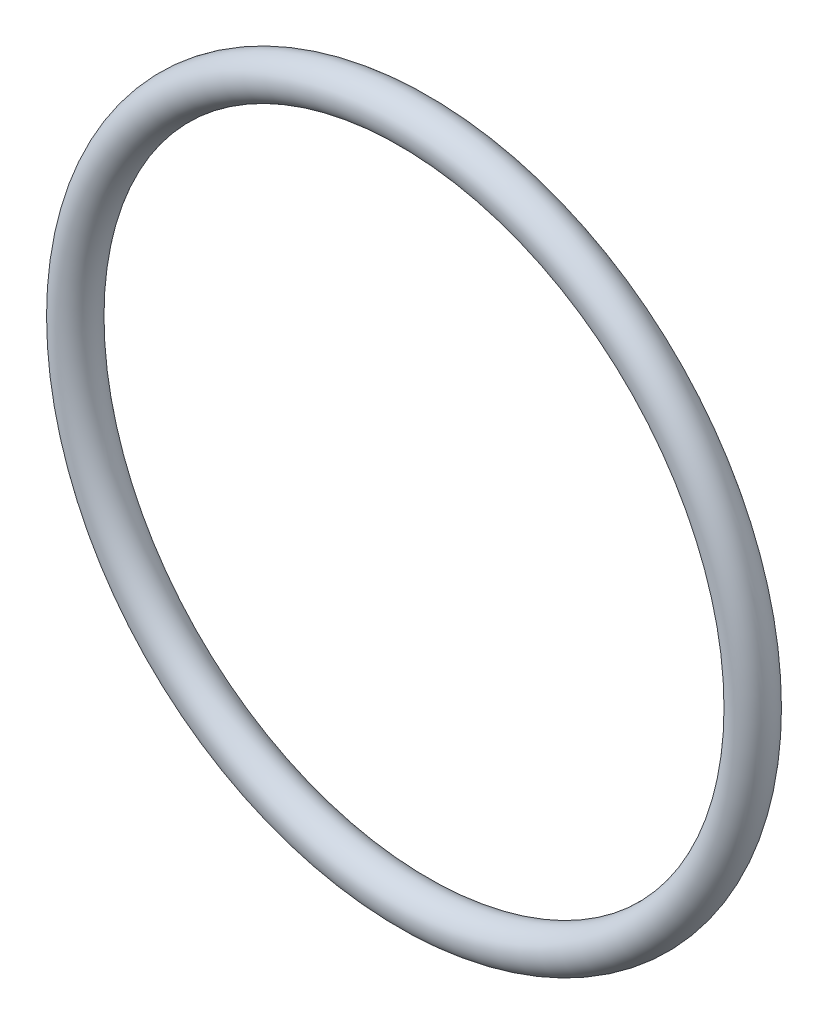
ISO-10303-21;
HEADER;
FILE_DESCRIPTION(('STEP AP214'),'2;1');
FILE_NAME('part.step','',(''),(''),'','','');
FILE_SCHEMA(('AUTOMOTIVE_DESIGN { 1 0 10303 214 1 1 1 1 }'));
ENDSEC;
DATA;
#1=APPLICATION_CONTEXT('core data for automotive mechanical design processes');
#2=APPLICATION_PROTOCOL_DEFINITION('international standard','automotive_design',2000,#1);
#3=PRODUCT_CONTEXT('',#1,'mechanical');
#4=PRODUCT('Part','Part','',(#3));
#5=PRODUCT_RELATED_PRODUCT_CATEGORY('part','',(#4));
#6=PRODUCT_DEFINITION_FORMATION('','',#4);
#7=PRODUCT_DEFINITION_CONTEXT('part definition',#1,'design');
#8=PRODUCT_DEFINITION('design','',#6,#7);
#9=PRODUCT_DEFINITION_SHAPE('','',#8);
#10=(LENGTH_UNIT() NAMED_UNIT(*) SI_UNIT(.MILLI.,.METRE.));
#11=(NAMED_UNIT(*) PLANE_ANGLE_UNIT() SI_UNIT($,.RADIAN.));
#12=(NAMED_UNIT(*) SI_UNIT($,.STERADIAN.) SOLID_ANGLE_UNIT());
#13=UNCERTAINTY_MEASURE_WITH_UNIT(LENGTH_MEASURE(1.E-05),#10,'distance_accuracy_value','');
#14=(GEOMETRIC_REPRESENTATION_CONTEXT(3) GLOBAL_UNCERTAINTY_ASSIGNED_CONTEXT((#13)) GLOBAL_UNIT_ASSIGNED_CONTEXT((#10,
#11,#12)) REPRESENTATION_CONTEXT('',''));
#15=CARTESIAN_POINT('',(0.,0.,0.));
#16=DIRECTION('',(0.,0.,1.));
#17=DIRECTION('',(1.,0.,0.));
#18=AXIS2_PLACEMENT_3D('',#15,#16,#17);
#19=CARTESIAN_POINT('',(0.,0.,0.));
#20=DIRECTION('',(0.,0.,1.));
#21=DIRECTION('',(1.,0.,0.));
#22=AXIS2_PLACEMENT_3D('',#19,#20,#21);
#23=TOROIDAL_SURFACE('',#22,25.4,1.524);
#24=CARTESIAN_POINT('',(25.4,0.,0.));
#25=DIRECTION('',(0.,1.,0.));
#26=DIRECTION('',(-1.,0.,0.));
#27=AXIS2_PLACEMENT_3D('',#24,#25,#26);
#28=CIRCLE('',#27,1.524);
#29=CARTESIAN_POINT('',(26.924,0.,0.));
#30=VERTEX_POINT('',#29);
#31=EDGE_CURVE('E11',#30,#30,#28,.T.);
#32=CARTESIAN_POINT('',(0.,0.,0.));
#33=DIRECTION('',(0.,0.,1.));
#34=DIRECTION('',(1.,0.,0.));
#35=AXIS2_PLACEMENT_3D('',#32,#33,#34);
#36=CIRCLE('',#35,26.924);
#37=EDGE_CURVE('',#30,#30,#36,.T.);
#38=ORIENTED_EDGE('',*,*,#31,.T.);
#39=ORIENTED_EDGE('',*,*,#31,.F.);
#40=ORIENTED_EDGE('',*,*,#37,.T.);
#41=ORIENTED_EDGE('',*,*,#37,.F.);
#42=EDGE_LOOP('',(#38,#40,#39,#41));
#43=FACE_BOUND('',#42,.T.);
#44=ADVANCED_FACE('F46',(#43),#23,.T.);
#45=CLOSED_SHELL('',(#44));
#46=MANIFOLD_SOLID_BREP('B2',#45);
#47=ADVANCED_BREP_SHAPE_REPRESENTATION('',(#18,#46),#14);
#48=SHAPE_DEFINITION_REPRESENTATION(#9,#47);
ENDSEC;
END-ISO-10303-21;
